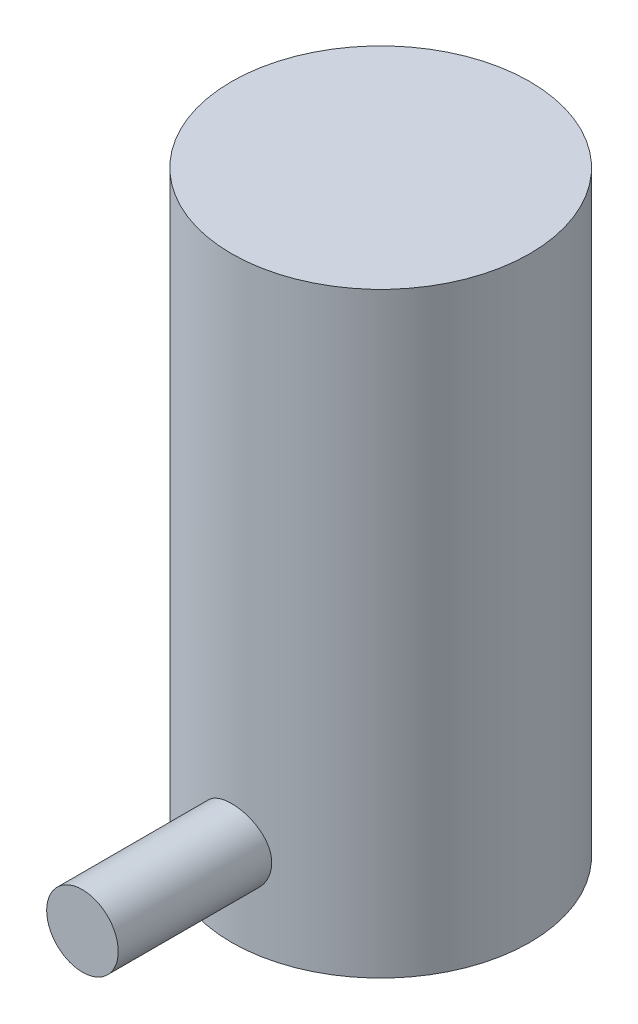
ISO-10303-21;
HEADER;
FILE_DESCRIPTION(('STEP AP214'),'2;1');
FILE_NAME('part.step','',(''),(''),'','','');
FILE_SCHEMA(('AUTOMOTIVE_DESIGN { 1 0 10303 214 1 1 1 1 }'));
ENDSEC;
DATA;
#1=APPLICATION_CONTEXT('core data for automotive mechanical design processes');
#2=APPLICATION_PROTOCOL_DEFINITION('international standard','automotive_design',2000,#1);
#3=PRODUCT_CONTEXT('',#1,'mechanical');
#4=PRODUCT('Part','Part','',(#3));
#5=PRODUCT_RELATED_PRODUCT_CATEGORY('part','',(#4));
#6=PRODUCT_DEFINITION_FORMATION('','',#4);
#7=PRODUCT_DEFINITION_CONTEXT('part definition',#1,'design');
#8=PRODUCT_DEFINITION('design','',#6,#7);
#9=PRODUCT_DEFINITION_SHAPE('','',#8);
#10=(LENGTH_UNIT() NAMED_UNIT(*) SI_UNIT(.MILLI.,.METRE.));
#11=(NAMED_UNIT(*) PLANE_ANGLE_UNIT() SI_UNIT($,.RADIAN.));
#12=(NAMED_UNIT(*) SI_UNIT($,.STERADIAN.) SOLID_ANGLE_UNIT());
#13=UNCERTAINTY_MEASURE_WITH_UNIT(LENGTH_MEASURE(1.E-05),#10,'distance_accuracy_value','');
#14=(GEOMETRIC_REPRESENTATION_CONTEXT(3) GLOBAL_UNCERTAINTY_ASSIGNED_CONTEXT((#13)) GLOBAL_UNIT_ASSIGNED_CONTEXT((#10,
#11,#12)) REPRESENTATION_CONTEXT('',''));
#15=CARTESIAN_POINT('',(0.,0.,0.));
#16=DIRECTION('',(0.,0.,1.));
#17=DIRECTION('',(1.,0.,0.));
#18=AXIS2_PLACEMENT_3D('',#15,#16,#17);
#19=CARTESIAN_POINT('',(0.,25.4,0.));
#20=DIRECTION('',(0.,-1.,0.));
#21=DIRECTION('',(0.,0.,-1.));
#22=AXIS2_PLACEMENT_3D('',#19,#20,#21);
#23=CYLINDRICAL_SURFACE('',#22,6.35);
#24=CARTESIAN_POINT('',(0.,25.4,0.));
#25=DIRECTION('',(0.,1.,0.));
#26=DIRECTION('',(0.,0.,1.));
#27=AXIS2_PLACEMENT_3D('',#24,#25,#26);
#28=CIRCLE('',#27,6.35);
#29=CARTESIAN_POINT('',(0.,25.4,6.35));
#30=VERTEX_POINT('',#29);
#31=EDGE_CURVE('E51',#30,#30,#28,.T.);
#32=ORIENTED_EDGE('',*,*,#31,.F.);
#33=EDGE_LOOP('',(#32));
#34=FACE_BOUND('',#33,.T.);
#35=CARTESIAN_POINT('',(0.,0.,0.));
#36=DIRECTION('',(0.,1.,0.));
#37=DIRECTION('',(0.,0.,1.));
#38=AXIS2_PLACEMENT_3D('',#35,#36,#37);
#39=CIRCLE('',#38,6.35);
#40=CARTESIAN_POINT('',(0.,0.,6.35));
#41=VERTEX_POINT('',#40);
#42=EDGE_CURVE('E56',#41,#41,#39,.T.);
#43=ORIENTED_EDGE('',*,*,#42,.T.);
#44=EDGE_LOOP('',(#43));
#45=FACE_BOUND('',#44,.T.);
#46=CARTESIAN_POINT('',(-1.524,3.59998377563531,6.16440783855189));
#47=CARTESIAN_POINT('',(-1.5239974226084,3.51571352815313,6.16440950040394));
#48=CARTESIAN_POINT('',(-1.51698656000359,3.43141398230983,6.16615471261443));
#49=CARTESIAN_POINT('',(-1.48916833167698,3.26522785245342,6.17293085958514));
#50=CARTESIAN_POINT('',(-1.46835229380644,3.18334281898333,6.17796385964136));
#51=CARTESIAN_POINT('',(-1.41362982625431,3.02441352957071,6.19071347767739));
#52=CARTESIAN_POINT('',(-1.37973944396961,2.94736347346477,6.1984268046874));
#53=CARTESIAN_POINT('',(-1.2998782830905,2.80003640745743,6.21566393275977));
#54=CARTESIAN_POINT('',(-1.25390724121996,2.72975954521117,6.22518777327775));
#55=CARTESIAN_POINT('',(-1.15019374819893,2.5965472176457,6.24518908868979));
#56=CARTESIAN_POINT('',(-1.092251493866,2.53376942039263,6.25568081255475));
#57=CARTESIAN_POINT('',(-0.966671047684625,2.41872355526275,6.27631176518938));
#58=CARTESIAN_POINT('',(-0.899032003464784,2.36645641226946,6.28645096287369));
#59=CARTESIAN_POINT('',(-0.754905449841881,2.27327754782065,6.30539129866511));
#60=CARTESIAN_POINT('',(-0.678315814514745,2.23251964567227,6.31417366017607));
#61=CARTESIAN_POINT('',(-0.519127050867773,2.16451469467784,6.32924876369161));
#62=CARTESIAN_POINT('',(-0.436528739509952,2.13726581301748,6.33554184340201));
#63=CARTESIAN_POINT('',(-0.269309673621846,2.09755439320697,6.34482860598793));
#64=CARTESIAN_POINT('',(-0.184755803990827,2.08482439081753,6.34788189562787));
#65=CARTESIAN_POINT('',(-0.014661171579736,2.07367363563195,6.35055237285706));
#66=CARTESIAN_POINT('',(0.070879454694101,2.07525092674584,6.35017003016526));
#67=CARTESIAN_POINT('',(0.238668152171908,2.09247533563408,6.34605708905427));
#68=CARTESIAN_POINT('',(0.320947780311489,2.10783389439294,6.34239516316153));
#69=CARTESIAN_POINT('',(0.48172619724127,2.15172237852044,6.33221388355049));
#70=CARTESIAN_POINT('',(0.560224793800638,2.18025297278755,6.3256943847206));
#71=CARTESIAN_POINT('',(0.711986642043756,2.24991628667118,6.31042363380006));
#72=CARTESIAN_POINT('',(0.785199804958171,2.29115390956566,6.30165390970025));
#73=CARTESIAN_POINT('',(0.923769424060553,2.38498159993778,6.28283750544897));
#74=CARTESIAN_POINT('',(0.989124607626296,2.43757350242813,6.27279061899799));
#75=CARTESIAN_POINT('',(1.11184271445029,2.55417199938629,6.25222191493314));
#76=CARTESIAN_POINT('',(1.16896518612279,2.61843093364915,6.24169450285585));
#77=CARTESIAN_POINT('',(1.27167413883743,2.75572619880377,6.22158274225918));
#78=CARTESIAN_POINT('',(1.31726016375621,2.82876287657807,6.21199843103689));
#79=CARTESIAN_POINT('',(1.39574009047391,2.98198412581701,6.1948395913499));
#80=CARTESIAN_POINT('',(1.42858029819518,3.06219722158228,6.18727360638079));
#81=CARTESIAN_POINT('',(1.48023744752889,3.22723020236136,6.17512014807819));
#82=CARTESIAN_POINT('',(1.49905712553295,3.31204918497379,6.17053209356349));
#83=CARTESIAN_POINT('',(1.52174879919161,3.48166721270616,6.16497485131075));
#84=CARTESIAN_POINT('',(1.52597451131117,3.56641618846452,6.16392004697435));
#85=CARTESIAN_POINT('',(1.52032311332554,3.73540803822125,6.16531637760675));
#86=CARTESIAN_POINT('',(1.5104471892682,3.81965095418442,6.16776721772597));
#87=CARTESIAN_POINT('',(1.47718196830091,3.98395350160714,6.17581703717015));
#88=CARTESIAN_POINT('',(1.45399486434277,4.06405659700198,6.18136887978174));
#89=CARTESIAN_POINT('',(1.39498788814311,4.2192397485333,6.19495114207963));
#90=CARTESIAN_POINT('',(1.35916661162342,4.29431924519671,6.20298183727603));
#91=CARTESIAN_POINT('',(1.27515489787525,4.43883338175516,6.22079981472444));
#92=CARTESIAN_POINT('',(1.22675083994173,4.50814013763044,6.23061645539051));
#93=CARTESIAN_POINT('',(1.11922078218074,4.63777734845335,6.25082645590849));
#94=CARTESIAN_POINT('',(1.0600931646063,4.6981064465359,6.26121990261244));
#95=CARTESIAN_POINT('',(0.931178531404212,4.80948860051682,6.28169996592795));
#96=CARTESIAN_POINT('',(0.861178770141203,4.86029812367806,6.29177413988181));
#97=CARTESIAN_POINT('',(0.713433989978142,4.9494392748825,6.31023342471778));
#98=CARTESIAN_POINT('',(0.635689365069336,4.98777153723719,6.31861862145484));
#99=CARTESIAN_POINT('',(0.475186340726963,5.05055109409102,6.33270366442953));
#100=CARTESIAN_POINT('',(0.392467455873028,5.07509503446029,6.3384221529822));
#101=CARTESIAN_POINT('',(0.223925138443576,5.10989582839692,6.34661076668623));
#102=CARTESIAN_POINT('',(0.138102257882291,5.1201552096351,6.3490814665336));
#103=CARTESIAN_POINT('',(-0.0319162849292614,5.12596287647111,6.35047478545375));
#104=CARTESIAN_POINT('',(-0.116099106684778,5.12187189565361,6.34948440999602));
#105=CARTESIAN_POINT('',(-0.28254024675797,5.09991475442242,6.34425761771568));
#106=CARTESIAN_POINT('',(-0.364798614254836,5.08204894641978,6.34002128393673));
#107=CARTESIAN_POINT('',(-0.524710830881248,5.03323626847643,6.32878975048686));
#108=CARTESIAN_POINT('',(-0.602384134411664,5.00234999835899,6.3218073415686));
#109=CARTESIAN_POINT('',(-0.75148903508898,4.92842905160819,6.30582218436173));
#110=CARTESIAN_POINT('',(-0.822919900346194,4.88539295297359,6.29681919961266));
#111=CARTESIAN_POINT('',(-0.959239641862086,4.78726843470121,6.27751616770254));
#112=CARTESIAN_POINT('',(-1.02394667764628,4.73193219969217,6.26719163338099));
#113=CARTESIAN_POINT('',(-1.14327915394824,4.61126566946112,6.24652612750739));
#114=CARTESIAN_POINT('',(-1.19790208278791,4.54593289176141,6.23618515250556));
#115=CARTESIAN_POINT('',(-1.29641338475408,4.40580416338402,6.21646080245968));
#116=CARTESIAN_POINT('',(-1.34010560854388,4.3308674443461,6.20709647443792));
#117=CARTESIAN_POINT('',(-1.41420632018711,4.17450035753813,6.19063581119769));
#118=CARTESIAN_POINT('',(-1.44462501090695,4.09307503445502,6.1835377351266));
#119=CARTESIAN_POINT('',(-1.48648133683619,3.94309060606254,6.17359146696688));
#120=CARTESIAN_POINT('',(-1.50052144248847,3.87528379490736,6.17017246727351));
#121=CARTESIAN_POINT('',(-1.51928149886027,3.738319097604,6.16558005121491));
#122=CARTESIAN_POINT('',(-1.52400211578341,3.66916130838743,6.16440647433584));
#123=CARTESIAN_POINT('',(-1.524,3.59998377563531,6.16440783855189));
#124=B_SPLINE_CURVE_WITH_KNOTS('',3,(#46,#47,#48,#49,#50,#51,#52,#53,#54,#55,#56,#57,#58,#59,
#60,#61,#62,#63,#64,#65,#66,#67,#68,#69,#70,#71,#72,#73,#74,#75,#76,#77,#78,#79,#80,#81,#82,#83,
#84,#85,#86,#87,#88,#89,#90,#91,#92,#93,#94,#95,#96,#97,#98,#99,#100,#101,#102,#103,#104,#105,
#106,#107,#108,#109,#110,#111,#112,#113,#114,#115,#116,#117,#118,#119,#120,#121,#122,#123),
.UNSPECIFIED.,.T.,.F.,(4,2,2,2,2,2,2,2,2,2,2,2,2,2,2,2,2,2,2,2,2,2,2,2,2,2,2,2,2,2,2,2,2,2,2,2,
2,2,4),(0.,0.252556879792232,0.505272561481761,0.757679042806292,1.01009102533009,
1.26711668442575,1.52416495057045,1.78450154029282,2.04480279960041,2.30022719270922,
2.55561666477847,2.80578032456845,3.05595668949399,3.30825638536078,3.56059688700325,
3.81924137581342,4.07789608920778,4.33762890271072,4.59731101078111,4.85065321963541,
5.10397412186399,5.35354529103672,5.60314420859163,5.85729411521513,6.11148239461499,
6.37148048144858,6.63146534859033,6.88960442202497,7.14769781161586,7.39935034900731,
7.65099644840901,7.90148404676129,8.15200097404141,8.40811555714191,8.66429384564129,
8.92478391790525,9.18507340700213,9.39241243131086,9.59973663345345),.UNSPECIFIED.);
#125=CARTESIAN_POINT('',(-1.524,3.59998377563531,6.16440783855189));
#126=VERTEX_POINT('',#125);
#127=EDGE_CURVE('E10',#126,#126,#124,.T.);
#128=ORIENTED_EDGE('',*,*,#127,.F.);
#129=EDGE_LOOP('',(#128));
#130=FACE_BOUND('',#129,.T.);
#131=ADVANCED_FACE('F39',(#34,#45,#130),#23,.T.);
#132=CARTESIAN_POINT('',(0.,25.4,0.));
#133=DIRECTION('',(0.,1.,0.));
#134=DIRECTION('',(0.,0.,1.));
#135=AXIS2_PLACEMENT_3D('',#132,#133,#134);
#136=PLANE('',#135);
#137=ORIENTED_EDGE('',*,*,#31,.T.);
#138=EDGE_LOOP('',(#137));
#139=FACE_BOUND('',#138,.T.);
#140=ADVANCED_FACE('F78',(#139),#136,.T.);
#141=CARTESIAN_POINT('',(0.,0.,0.));
#142=DIRECTION('',(0.,1.,0.));
#143=DIRECTION('',(0.,0.,1.));
#144=AXIS2_PLACEMENT_3D('',#141,#142,#143);
#145=PLANE('',#144);
#146=ORIENTED_EDGE('',*,*,#42,.F.);
#147=EDGE_LOOP('',(#146));
#148=FACE_BOUND('',#147,.T.);
#149=ADVANCED_FACE('F72',(#148),#145,.F.);
#150=CARTESIAN_POINT('',(0.,3.59998377563531,12.7));
#151=DIRECTION('',(0.,0.,-1.));
#152=DIRECTION('',(-1.,0.,0.));
#153=AXIS2_PLACEMENT_3D('',#150,#151,#152);
#154=CYLINDRICAL_SURFACE('',#153,1.524);
#155=CARTESIAN_POINT('',(0.,3.59998377563531,12.7));
#156=DIRECTION('',(0.,0.,1.));
#157=DIRECTION('',(1.,0.,0.));
#158=AXIS2_PLACEMENT_3D('',#155,#156,#157);
#159=CIRCLE('',#158,1.524);
#160=CARTESIAN_POINT('',(1.524,3.59998377563531,12.7));
#161=VERTEX_POINT('',#160);
#162=EDGE_CURVE('E62',#161,#161,#159,.T.);
#163=ORIENTED_EDGE('',*,*,#162,.F.);
#164=EDGE_LOOP('',(#163));
#165=FACE_BOUND('',#164,.T.);
#166=ORIENTED_EDGE('',*,*,#127,.T.);
#167=EDGE_LOOP('',(#166));
#168=FACE_BOUND('',#167,.T.);
#169=ADVANCED_FACE('F70',(#165,#168),#154,.T.);
#170=CARTESIAN_POINT('',(0.,3.59998377563531,12.7));
#171=DIRECTION('',(0.,0.,1.));
#172=DIRECTION('',(1.,0.,0.));
#173=AXIS2_PLACEMENT_3D('',#170,#171,#172);
#174=PLANE('',#173);
#175=ORIENTED_EDGE('',*,*,#162,.T.);
#176=EDGE_LOOP('',(#175));
#177=FACE_BOUND('',#176,.T.);
#178=ADVANCED_FACE('F68',(#177),#174,.T.);
#179=CLOSED_SHELL('',(#131,#140,#149,#169,#178));
#180=MANIFOLD_SOLID_BREP('B2',#179);
#181=ADVANCED_BREP_SHAPE_REPRESENTATION('',(#18,#180),#14);
#182=SHAPE_DEFINITION_REPRESENTATION(#9,#181);
ENDSEC;
END-ISO-10303-21;
